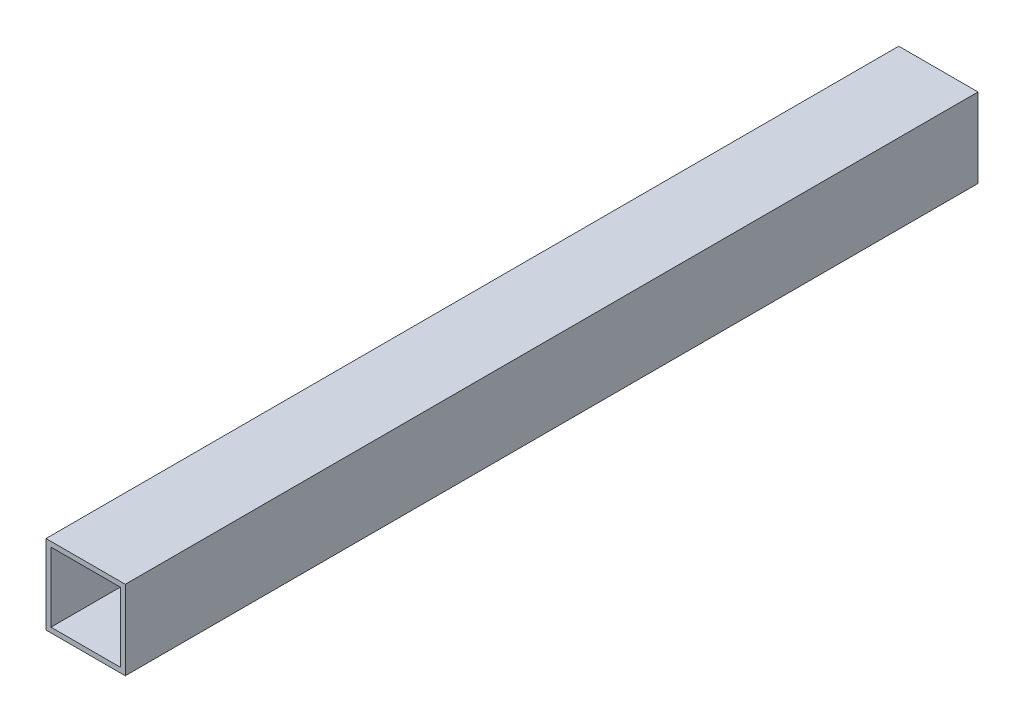
ISO-10303-21;
HEADER;
FILE_DESCRIPTION(('STEP AP214'),'2;1');
FILE_NAME('part.step','',(''),(''),'','','');
FILE_SCHEMA(('AUTOMOTIVE_DESIGN { 1 0 10303 214 1 1 1 1 }'));
ENDSEC;
DATA;
#1=APPLICATION_CONTEXT('core data for automotive mechanical design processes');
#2=APPLICATION_PROTOCOL_DEFINITION('international standard','automotive_design',2000,#1);
#3=PRODUCT_CONTEXT('',#1,'mechanical');
#4=PRODUCT('Part','Part','',(#3));
#5=PRODUCT_RELATED_PRODUCT_CATEGORY('part','',(#4));
#6=PRODUCT_DEFINITION_FORMATION('','',#4);
#7=PRODUCT_DEFINITION_CONTEXT('part definition',#1,'design');
#8=PRODUCT_DEFINITION('design','',#6,#7);
#9=PRODUCT_DEFINITION_SHAPE('','',#8);
#10=(LENGTH_UNIT() NAMED_UNIT(*) SI_UNIT(.MILLI.,.METRE.));
#11=(NAMED_UNIT(*) PLANE_ANGLE_UNIT() SI_UNIT($,.RADIAN.));
#12=(NAMED_UNIT(*) SI_UNIT($,.STERADIAN.) SOLID_ANGLE_UNIT());
#13=UNCERTAINTY_MEASURE_WITH_UNIT(LENGTH_MEASURE(1.E-05),#10,'distance_accuracy_value','');
#14=(GEOMETRIC_REPRESENTATION_CONTEXT(3) GLOBAL_UNCERTAINTY_ASSIGNED_CONTEXT((#13)) GLOBAL_UNIT_ASSIGNED_CONTEXT((#10,
#11,#12)) REPRESENTATION_CONTEXT('',''));
#15=CARTESIAN_POINT('',(0.,0.,0.));
#16=DIRECTION('',(0.,0.,1.));
#17=DIRECTION('',(1.,0.,0.));
#18=AXIS2_PLACEMENT_3D('',#15,#16,#17);
#19=CARTESIAN_POINT('',(0.,0.,546.534467));
#20=DIRECTION('',(0.,0.,1.));
#21=DIRECTION('',(1.,0.,0.));
#22=AXIS2_PLACEMENT_3D('',#19,#20,#21);
#23=PLANE('',#22);
#24=DIRECTION('',(0.,-1.,0.));
#25=VECTOR('',#24,1.);
#26=CARTESIAN_POINT('',(-18.2557100498323,23.6578232030462,546.534467));
#27=LINE('',#26,#25);
#28=CARTESIAN_POINT('',(-18.2557100498323,23.6578232030462,546.534467));
#29=VERTEX_POINT('',#28);
#30=CARTESIAN_POINT('',(-18.2557100498323,-27.1421767969538,546.534467));
#31=VERTEX_POINT('',#30);
#32=EDGE_CURVE('E139',#29,#31,#27,.T.);
#33=ORIENTED_EDGE('',*,*,#32,.T.);
#34=DIRECTION('',(1.,0.,0.));
#35=VECTOR('',#34,1.);
#36=CARTESIAN_POINT('',(-18.2557100498323,-27.1421767969538,546.534467));
#37=LINE('',#36,#35);
#38=CARTESIAN_POINT('',(32.5442899501677,-27.1421767969538,546.534467));
#39=VERTEX_POINT('',#38);
#40=EDGE_CURVE('E141',#31,#39,#37,.T.);
#41=ORIENTED_EDGE('',*,*,#40,.T.);
#42=DIRECTION('',(0.,1.,0.));
#43=VECTOR('',#42,1.);
#44=CARTESIAN_POINT('',(32.5442899501677,23.6578232030462,546.534467));
#45=LINE('',#44,#43);
#46=CARTESIAN_POINT('',(32.5442899501677,23.6578232030462,546.534467));
#47=VERTEX_POINT('',#46);
#48=EDGE_CURVE('E148',#39,#47,#45,.T.);
#49=ORIENTED_EDGE('',*,*,#48,.T.);
#50=DIRECTION('',(-1.,0.,0.));
#51=VECTOR('',#50,1.);
#52=CARTESIAN_POINT('',(-18.2557100498323,23.6578232030462,546.534467));
#53=LINE('',#52,#51);
#54=EDGE_CURVE('E146',#47,#29,#53,.T.);
#55=ORIENTED_EDGE('',*,*,#54,.T.);
#56=EDGE_LOOP('',(#33,#41,#49,#55));
#57=FACE_BOUND('',#56,.T.);
#58=DIRECTION('',(1.,0.,0.));
#59=VECTOR('',#58,1.);
#60=CARTESIAN_POINT('',(-15.0807100498323,-23.9671767969538,546.534467));
#61=LINE('',#60,#59);
#62=CARTESIAN_POINT('',(-15.0807100498323,-23.9671767969538,546.534467));
#63=VERTEX_POINT('',#62);
#64=CARTESIAN_POINT('',(29.3692899501677,-23.9671767969538,546.534467));
#65=VERTEX_POINT('',#64);
#66=EDGE_CURVE('E115',#63,#65,#61,.T.);
#67=ORIENTED_EDGE('',*,*,#66,.F.);
#68=DIRECTION('',(0.,-1.,0.));
#69=VECTOR('',#68,1.);
#70=CARTESIAN_POINT('',(-15.0807100498323,20.4828232030462,546.534467));
#71=LINE('',#70,#69);
#72=CARTESIAN_POINT('',(-15.0807100498323,20.4828232030462,546.534467));
#73=VERTEX_POINT('',#72);
#74=EDGE_CURVE('E102',#73,#63,#71,.T.);
#75=ORIENTED_EDGE('',*,*,#74,.F.);
#76=DIRECTION('',(-1.,0.,0.));
#77=VECTOR('',#76,1.);
#78=CARTESIAN_POINT('',(-15.0807100498323,20.4828232030462,546.534467));
#79=LINE('',#78,#77);
#80=CARTESIAN_POINT('',(29.3692899501677,20.4828232030462,546.534467));
#81=VERTEX_POINT('',#80);
#82=EDGE_CURVE('E127',#81,#73,#79,.T.);
#83=ORIENTED_EDGE('',*,*,#82,.F.);
#84=DIRECTION('',(0.,1.,0.));
#85=VECTOR('',#84,1.);
#86=CARTESIAN_POINT('',(29.3692899501677,20.4828232030462,546.534467));
#87=LINE('',#86,#85);
#88=EDGE_CURVE('E122',#65,#81,#87,.T.);
#89=ORIENTED_EDGE('',*,*,#88,.F.);
#90=EDGE_LOOP('',(#67,#75,#83,#89));
#91=FACE_BOUND('',#90,.T.);
#92=ADVANCED_FACE('F39',(#57,#91),#23,.T.);
#93=CARTESIAN_POINT('',(0.,0.,0.));
#94=DIRECTION('',(0.,0.,1.));
#95=DIRECTION('',(1.,0.,0.));
#96=AXIS2_PLACEMENT_3D('',#93,#94,#95);
#97=PLANE('',#96);
#98=DIRECTION('',(0.,-1.,0.));
#99=VECTOR('',#98,1.);
#100=CARTESIAN_POINT('',(-18.2557100498323,23.6578232030462,0.));
#101=LINE('',#100,#99);
#102=CARTESIAN_POINT('',(-18.2557100498323,23.6578232030462,0.));
#103=VERTEX_POINT('',#102);
#104=CARTESIAN_POINT('',(-18.2557100498323,-27.1421767969538,0.));
#105=VERTEX_POINT('',#104);
#106=EDGE_CURVE('E119',#103,#105,#101,.T.);
#107=ORIENTED_EDGE('',*,*,#106,.F.);
#108=DIRECTION('',(-1.,0.,0.));
#109=VECTOR('',#108,1.);
#110=CARTESIAN_POINT('',(-18.2557100498323,23.6578232030462,0.));
#111=LINE('',#110,#109);
#112=CARTESIAN_POINT('',(32.5442899501677,23.6578232030462,0.));
#113=VERTEX_POINT('',#112);
#114=EDGE_CURVE('E145',#113,#103,#111,.T.);
#115=ORIENTED_EDGE('',*,*,#114,.F.);
#116=DIRECTION('',(0.,1.,0.));
#117=VECTOR('',#116,1.);
#118=CARTESIAN_POINT('',(32.5442899501677,23.6578232030462,0.));
#119=LINE('',#118,#117);
#120=CARTESIAN_POINT('',(32.5442899501677,-27.1421767969538,0.));
#121=VERTEX_POINT('',#120);
#122=EDGE_CURVE('E154',#121,#113,#119,.T.);
#123=ORIENTED_EDGE('',*,*,#122,.F.);
#124=DIRECTION('',(1.,0.,0.));
#125=VECTOR('',#124,1.);
#126=CARTESIAN_POINT('',(-18.2557100498323,-27.1421767969538,0.));
#127=LINE('',#126,#125);
#128=EDGE_CURVE('E153',#105,#121,#127,.T.);
#129=ORIENTED_EDGE('',*,*,#128,.F.);
#130=EDGE_LOOP('',(#107,#115,#123,#129));
#131=FACE_BOUND('',#130,.T.);
#132=DIRECTION('',(0.,-1.,0.));
#133=VECTOR('',#132,1.);
#134=CARTESIAN_POINT('',(-15.0807100498323,20.4828232030462,0.));
#135=LINE('',#134,#133);
#136=CARTESIAN_POINT('',(-15.0807100498323,20.4828232030462,0.));
#137=VERTEX_POINT('',#136);
#138=CARTESIAN_POINT('',(-15.0807100498323,-23.9671767969538,0.));
#139=VERTEX_POINT('',#138);
#140=EDGE_CURVE('E65',#137,#139,#135,.T.);
#141=ORIENTED_EDGE('',*,*,#140,.T.);
#142=DIRECTION('',(1.,0.,0.));
#143=VECTOR('',#142,1.);
#144=CARTESIAN_POINT('',(-15.0807100498323,-23.9671767969538,0.));
#145=LINE('',#144,#143);
#146=CARTESIAN_POINT('',(29.3692899501677,-23.9671767969538,0.));
#147=VERTEX_POINT('',#146);
#148=EDGE_CURVE('E117',#139,#147,#145,.T.);
#149=ORIENTED_EDGE('',*,*,#148,.T.);
#150=DIRECTION('',(0.,1.,0.));
#151=VECTOR('',#150,1.);
#152=CARTESIAN_POINT('',(29.3692899501677,20.4828232030462,0.));
#153=LINE('',#152,#151);
#154=CARTESIAN_POINT('',(29.3692899501677,20.4828232030462,0.));
#155=VERTEX_POINT('',#154);
#156=EDGE_CURVE('E135',#147,#155,#153,.T.);
#157=ORIENTED_EDGE('',*,*,#156,.T.);
#158=DIRECTION('',(-1.,0.,0.));
#159=VECTOR('',#158,1.);
#160=CARTESIAN_POINT('',(-15.0807100498323,20.4828232030462,0.));
#161=LINE('',#160,#159);
#162=EDGE_CURVE('E114',#155,#137,#161,.T.);
#163=ORIENTED_EDGE('',*,*,#162,.T.);
#164=EDGE_LOOP('',(#141,#149,#157,#163));
#165=FACE_BOUND('',#164,.T.);
#166=ADVANCED_FACE('F171',(#131,#165),#97,.F.);
#167=CARTESIAN_POINT('',(-18.2557100498323,23.6578232030462,546.534467));
#168=DIRECTION('',(1.,0.,0.));
#169=DIRECTION('',(0.,1.,0.));
#170=AXIS2_PLACEMENT_3D('',#167,#168,#169);
#171=PLANE('',#170);
#172=ORIENTED_EDGE('',*,*,#106,.T.);
#173=DIRECTION('',(0.,0.,-1.));
#174=VECTOR('',#173,1.);
#175=CARTESIAN_POINT('',(-18.2557100498323,-27.1421767969538,546.534467));
#176=LINE('',#175,#174);
#177=EDGE_CURVE('E11',#31,#105,#176,.T.);
#178=ORIENTED_EDGE('',*,*,#177,.F.);
#179=ORIENTED_EDGE('',*,*,#32,.F.);
#180=DIRECTION('',(0.,0.,-1.));
#181=VECTOR('',#180,1.);
#182=CARTESIAN_POINT('',(-18.2557100498323,23.6578232030462,546.534467));
#183=LINE('',#182,#181);
#184=EDGE_CURVE('E147',#29,#103,#183,.T.);
#185=ORIENTED_EDGE('',*,*,#184,.T.);
#186=EDGE_LOOP('',(#172,#178,#179,#185));
#187=FACE_BOUND('',#186,.T.);
#188=ADVANCED_FACE('F41',(#187),#171,.F.);
#189=CARTESIAN_POINT('',(-18.2557100498323,-27.1421767969538,546.534467));
#190=DIRECTION('',(0.,1.,0.));
#191=DIRECTION('',(0.,0.,1.));
#192=AXIS2_PLACEMENT_3D('',#189,#190,#191);
#193=PLANE('',#192);
#194=ORIENTED_EDGE('',*,*,#128,.T.);
#195=DIRECTION('',(0.,0.,-1.));
#196=VECTOR('',#195,1.);
#197=CARTESIAN_POINT('',(32.5442899501677,-27.1421767969538,546.534467));
#198=LINE('',#197,#196);
#199=EDGE_CURVE('E50',#39,#121,#198,.T.);
#200=ORIENTED_EDGE('',*,*,#199,.F.);
#201=ORIENTED_EDGE('',*,*,#40,.F.);
#202=ORIENTED_EDGE('',*,*,#177,.T.);
#203=EDGE_LOOP('',(#194,#200,#201,#202));
#204=FACE_BOUND('',#203,.T.);
#205=ADVANCED_FACE('F181',(#204),#193,.F.);
#206=CARTESIAN_POINT('',(32.5442899501677,23.6578232030462,546.534467));
#207=DIRECTION('',(-1.,0.,0.));
#208=DIRECTION('',(0.,-1.,0.));
#209=AXIS2_PLACEMENT_3D('',#206,#207,#208);
#210=PLANE('',#209);
#211=ORIENTED_EDGE('',*,*,#122,.T.);
#212=DIRECTION('',(0.,0.,-1.));
#213=VECTOR('',#212,1.);
#214=CARTESIAN_POINT('',(32.5442899501677,23.6578232030462,546.534467));
#215=LINE('',#214,#213);
#216=EDGE_CURVE('E159',#47,#113,#215,.T.);
#217=ORIENTED_EDGE('',*,*,#216,.F.);
#218=ORIENTED_EDGE('',*,*,#48,.F.);
#219=ORIENTED_EDGE('',*,*,#199,.T.);
#220=EDGE_LOOP('',(#211,#217,#218,#219));
#221=FACE_BOUND('',#220,.T.);
#222=ADVANCED_FACE('F170',(#221),#210,.F.);
#223=CARTESIAN_POINT('',(-18.2557100498323,23.6578232030462,546.534467));
#224=DIRECTION('',(0.,-1.,0.));
#225=DIRECTION('',(0.,0.,-1.));
#226=AXIS2_PLACEMENT_3D('',#223,#224,#225);
#227=PLANE('',#226);
#228=ORIENTED_EDGE('',*,*,#114,.T.);
#229=ORIENTED_EDGE('',*,*,#184,.F.);
#230=ORIENTED_EDGE('',*,*,#54,.F.);
#231=ORIENTED_EDGE('',*,*,#216,.T.);
#232=EDGE_LOOP('',(#228,#229,#230,#231));
#233=FACE_BOUND('',#232,.T.);
#234=ADVANCED_FACE('F180',(#233),#227,.F.);
#235=CARTESIAN_POINT('',(-15.0807100498323,20.4828232030462,546.534467));
#236=DIRECTION('',(1.,0.,0.));
#237=DIRECTION('',(0.,1.,0.));
#238=AXIS2_PLACEMENT_3D('',#235,#236,#237);
#239=PLANE('',#238);
#240=ORIENTED_EDGE('',*,*,#140,.F.);
#241=DIRECTION('',(0.,0.,-1.));
#242=VECTOR('',#241,1.);
#243=CARTESIAN_POINT('',(-15.0807100498323,20.4828232030462,546.534467));
#244=LINE('',#243,#242);
#245=EDGE_CURVE('E107',#73,#137,#244,.T.);
#246=ORIENTED_EDGE('',*,*,#245,.F.);
#247=ORIENTED_EDGE('',*,*,#74,.T.);
#248=DIRECTION('',(0.,0.,-1.));
#249=VECTOR('',#248,1.);
#250=CARTESIAN_POINT('',(-15.0807100498323,-23.9671767969538,546.534467));
#251=LINE('',#250,#249);
#252=EDGE_CURVE('E110',#63,#139,#251,.T.);
#253=ORIENTED_EDGE('',*,*,#252,.T.);
#254=EDGE_LOOP('',(#240,#246,#247,#253));
#255=FACE_BOUND('',#254,.T.);
#256=ADVANCED_FACE('F106',(#255),#239,.T.);
#257=CARTESIAN_POINT('',(-15.0807100498323,-23.9671767969538,546.534467));
#258=DIRECTION('',(0.,1.,0.));
#259=DIRECTION('',(0.,0.,1.));
#260=AXIS2_PLACEMENT_3D('',#257,#258,#259);
#261=PLANE('',#260);
#262=ORIENTED_EDGE('',*,*,#148,.F.);
#263=ORIENTED_EDGE('',*,*,#252,.F.);
#264=ORIENTED_EDGE('',*,*,#66,.T.);
#265=DIRECTION('',(0.,0.,-1.));
#266=VECTOR('',#265,1.);
#267=CARTESIAN_POINT('',(29.3692899501677,-23.9671767969538,546.534467));
#268=LINE('',#267,#266);
#269=EDGE_CURVE('E123',#65,#147,#268,.T.);
#270=ORIENTED_EDGE('',*,*,#269,.T.);
#271=EDGE_LOOP('',(#262,#263,#264,#270));
#272=FACE_BOUND('',#271,.T.);
#273=ADVANCED_FACE('F118',(#272),#261,.T.);
#274=CARTESIAN_POINT('',(29.3692899501677,20.4828232030462,546.534467));
#275=DIRECTION('',(-1.,0.,0.));
#276=DIRECTION('',(0.,-1.,0.));
#277=AXIS2_PLACEMENT_3D('',#274,#275,#276);
#278=PLANE('',#277);
#279=ORIENTED_EDGE('',*,*,#156,.F.);
#280=ORIENTED_EDGE('',*,*,#269,.F.);
#281=ORIENTED_EDGE('',*,*,#88,.T.);
#282=DIRECTION('',(0.,0.,-1.));
#283=VECTOR('',#282,1.);
#284=CARTESIAN_POINT('',(29.3692899501677,20.4828232030462,546.534467));
#285=LINE('',#284,#283);
#286=EDGE_CURVE('E53',#81,#155,#285,.T.);
#287=ORIENTED_EDGE('',*,*,#286,.T.);
#288=EDGE_LOOP('',(#279,#280,#281,#287));
#289=FACE_BOUND('',#288,.T.);
#290=ADVANCED_FACE('F206',(#289),#278,.T.);
#291=CARTESIAN_POINT('',(-15.0807100498323,20.4828232030462,546.534467));
#292=DIRECTION('',(0.,-1.,0.));
#293=DIRECTION('',(0.,0.,-1.));
#294=AXIS2_PLACEMENT_3D('',#291,#292,#293);
#295=PLANE('',#294);
#296=ORIENTED_EDGE('',*,*,#162,.F.);
#297=ORIENTED_EDGE('',*,*,#286,.F.);
#298=ORIENTED_EDGE('',*,*,#82,.T.);
#299=ORIENTED_EDGE('',*,*,#245,.T.);
#300=EDGE_LOOP('',(#296,#297,#298,#299));
#301=FACE_BOUND('',#300,.T.);
#302=ADVANCED_FACE('F209',(#301),#295,.T.);
#303=CLOSED_SHELL('',(#92,#166,#188,#205,#222,#234,#256,#273,#290,#302));
#304=MANIFOLD_SOLID_BREP('B2',#303);
#305=ADVANCED_BREP_SHAPE_REPRESENTATION('',(#18,#304),#14);
#306=SHAPE_DEFINITION_REPRESENTATION(#9,#305);
ENDSEC;
END-ISO-10303-21;
